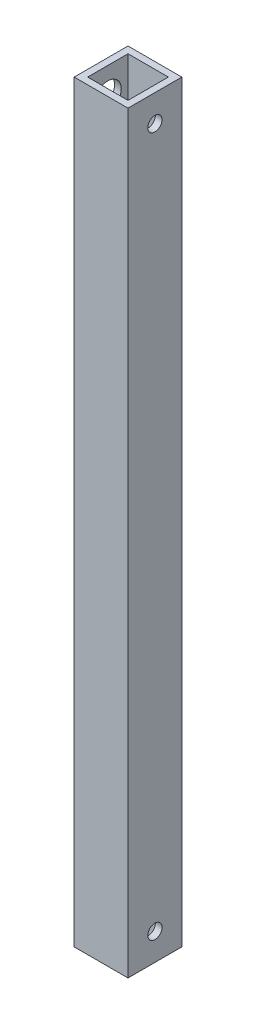
ISO-10303-21;
HEADER;
FILE_DESCRIPTION(('STEP AP214'),'2;1');
FILE_NAME('part.step','',(''),(''),'','','');
FILE_SCHEMA(('AUTOMOTIVE_DESIGN { 1 0 10303 214 1 1 1 1 }'));
ENDSEC;
DATA;
#1=APPLICATION_CONTEXT('core data for automotive mechanical design processes');
#2=APPLICATION_PROTOCOL_DEFINITION('international standard','automotive_design',2000,#1);
#3=PRODUCT_CONTEXT('',#1,'mechanical');
#4=PRODUCT('Part','Part','',(#3));
#5=PRODUCT_RELATED_PRODUCT_CATEGORY('part','',(#4));
#6=PRODUCT_DEFINITION_FORMATION('','',#4);
#7=PRODUCT_DEFINITION_CONTEXT('part definition',#1,'design');
#8=PRODUCT_DEFINITION('design','',#6,#7);
#9=PRODUCT_DEFINITION_SHAPE('','',#8);
#10=(LENGTH_UNIT() NAMED_UNIT(*) SI_UNIT(.MILLI.,.METRE.));
#11=(NAMED_UNIT(*) PLANE_ANGLE_UNIT() SI_UNIT($,.RADIAN.));
#12=(NAMED_UNIT(*) SI_UNIT($,.STERADIAN.) SOLID_ANGLE_UNIT());
#13=UNCERTAINTY_MEASURE_WITH_UNIT(LENGTH_MEASURE(1.E-05),#10,'distance_accuracy_value','');
#14=(GEOMETRIC_REPRESENTATION_CONTEXT(3) GLOBAL_UNCERTAINTY_ASSIGNED_CONTEXT((#13)) GLOBAL_UNIT_ASSIGNED_CONTEXT((#10,
#11,#12)) REPRESENTATION_CONTEXT('',''));
#15=CARTESIAN_POINT('',(0.,0.,0.));
#16=DIRECTION('',(0.,0.,1.));
#17=DIRECTION('',(1.,0.,0.));
#18=AXIS2_PLACEMENT_3D('',#15,#16,#17);
#19=CARTESIAN_POINT('',(0.,355.6,0.));
#20=DIRECTION('',(0.,-1.,0.));
#21=DIRECTION('',(0.,0.,-1.));
#22=AXIS2_PLACEMENT_3D('',#19,#20,#21);
#23=PLANE('',#22);
#24=DIRECTION('',(0.,0.,1.));
#25=VECTOR('',#24,1.);
#26=CARTESIAN_POINT('',(0.,355.6,0.));
#27=LINE('',#26,#25);
#28=CARTESIAN_POINT('',(0.,355.6,-25.4));
#29=VERTEX_POINT('',#28);
#30=CARTESIAN_POINT('',(0.,355.6,0.));
#31=VERTEX_POINT('',#30);
#32=EDGE_CURVE('E135',#29,#31,#27,.T.);
#33=ORIENTED_EDGE('',*,*,#32,.T.);
#34=DIRECTION('',(1.,0.,0.));
#35=VECTOR('',#34,1.);
#36=CARTESIAN_POINT('',(0.,355.6,0.));
#37=LINE('',#36,#35);
#38=CARTESIAN_POINT('',(25.4,355.6,0.));
#39=VERTEX_POINT('',#38);
#40=EDGE_CURVE('E138',#31,#39,#37,.T.);
#41=ORIENTED_EDGE('',*,*,#40,.T.);
#42=DIRECTION('',(0.,0.,-1.));
#43=VECTOR('',#42,1.);
#44=CARTESIAN_POINT('',(25.4,355.6,0.));
#45=LINE('',#44,#43);
#46=CARTESIAN_POINT('',(25.4,355.6,-25.4));
#47=VERTEX_POINT('',#46);
#48=EDGE_CURVE('E141',#39,#47,#45,.T.);
#49=ORIENTED_EDGE('',*,*,#48,.T.);
#50=DIRECTION('',(-1.,0.,0.));
#51=VECTOR('',#50,1.);
#52=CARTESIAN_POINT('',(0.,355.6,-25.4));
#53=LINE('',#52,#51);
#54=EDGE_CURVE('E143',#47,#29,#53,.T.);
#55=ORIENTED_EDGE('',*,*,#54,.T.);
#56=EDGE_LOOP('',(#33,#41,#49,#55));
#57=FACE_BOUND('',#56,.T.);
#58=DIRECTION('',(1.,0.,0.));
#59=VECTOR('',#58,1.);
#60=CARTESIAN_POINT('',(3.175,355.6,-3.175));
#61=LINE('',#60,#59);
#62=CARTESIAN_POINT('',(3.175,355.6,-3.175));
#63=VERTEX_POINT('',#62);
#64=CARTESIAN_POINT('',(22.225,355.6,-3.175));
#65=VERTEX_POINT('',#64);
#66=EDGE_CURVE('E97',#63,#65,#61,.T.);
#67=ORIENTED_EDGE('',*,*,#66,.F.);
#68=DIRECTION('',(0.,0.,1.));
#69=VECTOR('',#68,1.);
#70=CARTESIAN_POINT('',(3.175,355.6,-3.175));
#71=LINE('',#70,#69);
#72=CARTESIAN_POINT('',(3.175,355.6,-22.225));
#73=VERTEX_POINT('',#72);
#74=EDGE_CURVE('E119',#73,#63,#71,.T.);
#75=ORIENTED_EDGE('',*,*,#74,.F.);
#76=DIRECTION('',(-1.,0.,0.));
#77=VECTOR('',#76,1.);
#78=CARTESIAN_POINT('',(3.175,355.6,-22.225));
#79=LINE('',#78,#77);
#80=CARTESIAN_POINT('',(22.225,355.6,-22.225));
#81=VERTEX_POINT('',#80);
#82=EDGE_CURVE('E117',#81,#73,#79,.T.);
#83=ORIENTED_EDGE('',*,*,#82,.F.);
#84=DIRECTION('',(0.,0.,-1.));
#85=VECTOR('',#84,1.);
#86=CARTESIAN_POINT('',(22.225,355.6,-3.175));
#87=LINE('',#86,#85);
#88=EDGE_CURVE('E105',#65,#81,#87,.T.);
#89=ORIENTED_EDGE('',*,*,#88,.F.);
#90=EDGE_LOOP('',(#67,#75,#83,#89));
#91=FACE_BOUND('',#90,.T.);
#92=ADVANCED_FACE('F32',(#57,#91),#23,.F.);
#93=CARTESIAN_POINT('',(0.,0.,0.));
#94=DIRECTION('',(0.,-1.,0.));
#95=DIRECTION('',(0.,0.,-1.));
#96=AXIS2_PLACEMENT_3D('',#93,#94,#95);
#97=PLANE('',#96);
#98=DIRECTION('',(0.,0.,1.));
#99=VECTOR('',#98,1.);
#100=CARTESIAN_POINT('',(0.,0.,0.));
#101=LINE('',#100,#99);
#102=CARTESIAN_POINT('',(0.,0.,-25.4));
#103=VERTEX_POINT('',#102);
#104=CARTESIAN_POINT('',(0.,0.,0.));
#105=VERTEX_POINT('',#104);
#106=EDGE_CURVE('E113',#103,#105,#101,.T.);
#107=ORIENTED_EDGE('',*,*,#106,.F.);
#108=DIRECTION('',(-1.,0.,0.));
#109=VECTOR('',#108,1.);
#110=CARTESIAN_POINT('',(0.,0.,-25.4));
#111=LINE('',#110,#109);
#112=CARTESIAN_POINT('',(25.4,0.,-25.4));
#113=VERTEX_POINT('',#112);
#114=EDGE_CURVE('E139',#113,#103,#111,.T.);
#115=ORIENTED_EDGE('',*,*,#114,.F.);
#116=DIRECTION('',(0.,0.,-1.));
#117=VECTOR('',#116,1.);
#118=CARTESIAN_POINT('',(25.4,0.,0.));
#119=LINE('',#118,#117);
#120=CARTESIAN_POINT('',(25.4,0.,0.));
#121=VERTEX_POINT('',#120);
#122=EDGE_CURVE('E150',#121,#113,#119,.T.);
#123=ORIENTED_EDGE('',*,*,#122,.F.);
#124=DIRECTION('',(1.,0.,0.));
#125=VECTOR('',#124,1.);
#126=CARTESIAN_POINT('',(0.,0.,0.));
#127=LINE('',#126,#125);
#128=EDGE_CURVE('E148',#105,#121,#127,.T.);
#129=ORIENTED_EDGE('',*,*,#128,.F.);
#130=EDGE_LOOP('',(#107,#115,#123,#129));
#131=FACE_BOUND('',#130,.T.);
#132=DIRECTION('',(0.,0.,1.));
#133=VECTOR('',#132,1.);
#134=CARTESIAN_POINT('',(3.175,0.,-3.175));
#135=LINE('',#134,#133);
#136=CARTESIAN_POINT('',(3.175,0.,-22.225));
#137=VERTEX_POINT('',#136);
#138=CARTESIAN_POINT('',(3.175,0.,-3.175));
#139=VERTEX_POINT('',#138);
#140=EDGE_CURVE('E106',#137,#139,#135,.T.);
#141=ORIENTED_EDGE('',*,*,#140,.T.);
#142=DIRECTION('',(1.,0.,0.));
#143=VECTOR('',#142,1.);
#144=CARTESIAN_POINT('',(3.175,0.,-3.175));
#145=LINE('',#144,#143);
#146=CARTESIAN_POINT('',(22.225,0.,-3.175));
#147=VERTEX_POINT('',#146);
#148=EDGE_CURVE('E55',#139,#147,#145,.T.);
#149=ORIENTED_EDGE('',*,*,#148,.T.);
#150=DIRECTION('',(0.,0.,-1.));
#151=VECTOR('',#150,1.);
#152=CARTESIAN_POINT('',(22.225,0.,-3.175));
#153=LINE('',#152,#151);
#154=CARTESIAN_POINT('',(22.225,0.,-22.225));
#155=VERTEX_POINT('',#154);
#156=EDGE_CURVE('E112',#147,#155,#153,.T.);
#157=ORIENTED_EDGE('',*,*,#156,.T.);
#158=DIRECTION('',(-1.,0.,0.));
#159=VECTOR('',#158,1.);
#160=CARTESIAN_POINT('',(3.175,0.,-22.225));
#161=LINE('',#160,#159);
#162=EDGE_CURVE('E127',#155,#137,#161,.T.);
#163=ORIENTED_EDGE('',*,*,#162,.T.);
#164=EDGE_LOOP('',(#141,#149,#157,#163));
#165=FACE_BOUND('',#164,.T.);
#166=ADVANCED_FACE('F168',(#131,#165),#97,.T.);
#167=CARTESIAN_POINT('',(0.,355.6,0.));
#168=DIRECTION('',(1.,0.,0.));
#169=DIRECTION('',(0.,0.,-1.));
#170=AXIS2_PLACEMENT_3D('',#167,#168,#169);
#171=PLANE('',#170);
#172=CARTESIAN_POINT('',(0.,12.7,-12.7));
#173=DIRECTION('',(-1.,0.,0.));
#174=DIRECTION('',(0.,0.,1.));
#175=AXIS2_PLACEMENT_3D('',#172,#173,#174);
#176=CIRCLE('',#175,6.35);
#177=CARTESIAN_POINT('',(0.,12.7,-6.34999999999997));
#178=VERTEX_POINT('',#177);
#179=EDGE_CURVE('E240',#178,#178,#176,.T.);
#180=ORIENTED_EDGE('',*,*,#179,.F.);
#181=EDGE_LOOP('',(#180));
#182=FACE_BOUND('',#181,.T.);
#183=CARTESIAN_POINT('',(0.,342.9,-12.7));
#184=DIRECTION('',(-1.,0.,0.));
#185=DIRECTION('',(0.,0.,1.));
#186=AXIS2_PLACEMENT_3D('',#183,#184,#185);
#187=CIRCLE('',#186,6.35);
#188=CARTESIAN_POINT('',(0.,342.9,-6.34999999999997));
#189=VERTEX_POINT('',#188);
#190=EDGE_CURVE('E244',#189,#189,#187,.T.);
#191=ORIENTED_EDGE('',*,*,#190,.F.);
#192=EDGE_LOOP('',(#191));
#193=FACE_BOUND('',#192,.T.);
#194=ORIENTED_EDGE('',*,*,#106,.T.);
#195=DIRECTION('',(0.,-1.,0.));
#196=VECTOR('',#195,1.);
#197=CARTESIAN_POINT('',(0.,355.6,0.));
#198=LINE('',#197,#196);
#199=EDGE_CURVE('E11',#31,#105,#198,.T.);
#200=ORIENTED_EDGE('',*,*,#199,.F.);
#201=ORIENTED_EDGE('',*,*,#32,.F.);
#202=DIRECTION('',(0.,-1.,0.));
#203=VECTOR('',#202,1.);
#204=CARTESIAN_POINT('',(0.,355.6,-25.4));
#205=LINE('',#204,#203);
#206=EDGE_CURVE('E145',#29,#103,#205,.T.);
#207=ORIENTED_EDGE('',*,*,#206,.T.);
#208=EDGE_LOOP('',(#194,#200,#201,#207));
#209=FACE_BOUND('',#208,.T.);
#210=ADVANCED_FACE('F34',(#182,#193,#209),#171,.F.);
#211=CARTESIAN_POINT('',(0.,355.6,0.));
#212=DIRECTION('',(0.,0.,-1.));
#213=DIRECTION('',(-1.,0.,0.));
#214=AXIS2_PLACEMENT_3D('',#211,#212,#213);
#215=PLANE('',#214);
#216=ORIENTED_EDGE('',*,*,#128,.T.);
#217=DIRECTION('',(0.,-1.,0.));
#218=VECTOR('',#217,1.);
#219=CARTESIAN_POINT('',(25.4,355.6,0.));
#220=LINE('',#219,#218);
#221=EDGE_CURVE('E40',#39,#121,#220,.T.);
#222=ORIENTED_EDGE('',*,*,#221,.F.);
#223=ORIENTED_EDGE('',*,*,#40,.F.);
#224=ORIENTED_EDGE('',*,*,#199,.T.);
#225=EDGE_LOOP('',(#216,#222,#223,#224));
#226=FACE_BOUND('',#225,.T.);
#227=ADVANCED_FACE('F178',(#226),#215,.F.);
#228=CARTESIAN_POINT('',(25.4,355.6,0.));
#229=DIRECTION('',(-1.,0.,0.));
#230=DIRECTION('',(0.,0.,1.));
#231=AXIS2_PLACEMENT_3D('',#228,#229,#230);
#232=PLANE('',#231);
#233=CARTESIAN_POINT('',(25.4,342.9,-12.7));
#234=DIRECTION('',(-1.,0.,0.));
#235=DIRECTION('',(0.,0.,-1.));
#236=AXIS2_PLACEMENT_3D('',#233,#234,#235);
#237=CIRCLE('',#236,3.3734375);
#238=CARTESIAN_POINT('',(25.4,342.9,-16.0734375));
#239=VERTEX_POINT('',#238);
#240=EDGE_CURVE('E249',#239,#239,#237,.T.);
#241=ORIENTED_EDGE('',*,*,#240,.T.);
#242=EDGE_LOOP('',(#241));
#243=FACE_BOUND('',#242,.T.);
#244=CARTESIAN_POINT('',(25.4,12.7,-12.7));
#245=DIRECTION('',(1.,0.,0.));
#246=DIRECTION('',(0.,0.,-1.));
#247=AXIS2_PLACEMENT_3D('',#244,#245,#246);
#248=CIRCLE('',#247,3.3734375);
#249=CARTESIAN_POINT('',(25.4,12.7,-16.0734375));
#250=VERTEX_POINT('',#249);
#251=EDGE_CURVE('E255',#250,#250,#248,.T.);
#252=ORIENTED_EDGE('',*,*,#251,.F.);
#253=EDGE_LOOP('',(#252));
#254=FACE_BOUND('',#253,.T.);
#255=ORIENTED_EDGE('',*,*,#122,.T.);
#256=DIRECTION('',(0.,-1.,0.));
#257=VECTOR('',#256,1.);
#258=CARTESIAN_POINT('',(25.4,355.6,-25.4));
#259=LINE('',#258,#257);
#260=EDGE_CURVE('E155',#47,#113,#259,.T.);
#261=ORIENTED_EDGE('',*,*,#260,.F.);
#262=ORIENTED_EDGE('',*,*,#48,.F.);
#263=ORIENTED_EDGE('',*,*,#221,.T.);
#264=EDGE_LOOP('',(#255,#261,#262,#263));
#265=FACE_BOUND('',#264,.T.);
#266=ADVANCED_FACE('F162',(#243,#254,#265),#232,.F.);
#267=CARTESIAN_POINT('',(0.,355.6,-25.4));
#268=DIRECTION('',(0.,0.,1.));
#269=DIRECTION('',(1.,0.,0.));
#270=AXIS2_PLACEMENT_3D('',#267,#268,#269);
#271=PLANE('',#270);
#272=ORIENTED_EDGE('',*,*,#114,.T.);
#273=ORIENTED_EDGE('',*,*,#206,.F.);
#274=ORIENTED_EDGE('',*,*,#54,.F.);
#275=ORIENTED_EDGE('',*,*,#260,.T.);
#276=EDGE_LOOP('',(#272,#273,#274,#275));
#277=FACE_BOUND('',#276,.T.);
#278=ADVANCED_FACE('F172',(#277),#271,.F.);
#279=CARTESIAN_POINT('',(3.175,355.6,-3.175));
#280=DIRECTION('',(0.,0.,-1.));
#281=DIRECTION('',(-1.,0.,0.));
#282=AXIS2_PLACEMENT_3D('',#279,#280,#281);
#283=PLANE('',#282);
#284=ORIENTED_EDGE('',*,*,#148,.F.);
#285=DIRECTION('',(0.,-1.,0.));
#286=VECTOR('',#285,1.);
#287=CARTESIAN_POINT('',(3.175,355.6,-3.175));
#288=LINE('',#287,#286);
#289=EDGE_CURVE('E101',#63,#139,#288,.T.);
#290=ORIENTED_EDGE('',*,*,#289,.F.);
#291=ORIENTED_EDGE('',*,*,#66,.T.);
#292=DIRECTION('',(0.,-1.,0.));
#293=VECTOR('',#292,1.);
#294=CARTESIAN_POINT('',(22.225,355.6,-3.175));
#295=LINE('',#294,#293);
#296=EDGE_CURVE('E100',#65,#147,#295,.T.);
#297=ORIENTED_EDGE('',*,*,#296,.T.);
#298=EDGE_LOOP('',(#284,#290,#291,#297));
#299=FACE_BOUND('',#298,.T.);
#300=ADVANCED_FACE('F99',(#299),#283,.T.);
#301=CARTESIAN_POINT('',(22.225,355.6,-3.175));
#302=DIRECTION('',(-1.,0.,0.));
#303=DIRECTION('',(0.,0.,1.));
#304=AXIS2_PLACEMENT_3D('',#301,#302,#303);
#305=PLANE('',#304);
#306=CARTESIAN_POINT('',(22.225,342.9,-12.7));
#307=DIRECTION('',(-1.,0.,0.));
#308=DIRECTION('',(0.,0.,1.));
#309=AXIS2_PLACEMENT_3D('',#306,#307,#308);
#310=CIRCLE('',#309,3.3734375);
#311=CARTESIAN_POINT('',(22.225,342.9,-16.0734375));
#312=VERTEX_POINT('',#311);
#313=EDGE_CURVE('E253',#312,#312,#310,.F.);
#314=ORIENTED_EDGE('',*,*,#313,.T.);
#315=EDGE_LOOP('',(#314));
#316=FACE_BOUND('',#315,.T.);
#317=CARTESIAN_POINT('',(22.225,12.7,-12.7));
#318=DIRECTION('',(-1.,0.,0.));
#319=DIRECTION('',(0.,0.,1.));
#320=AXIS2_PLACEMENT_3D('',#317,#318,#319);
#321=CIRCLE('',#320,3.3734375);
#322=CARTESIAN_POINT('',(22.225,12.7,-9.32656249999998));
#323=VERTEX_POINT('',#322);
#324=EDGE_CURVE('E125',#323,#323,#321,.T.);
#325=ORIENTED_EDGE('',*,*,#324,.F.);
#326=EDGE_LOOP('',(#325));
#327=FACE_BOUND('',#326,.T.);
#328=ORIENTED_EDGE('',*,*,#156,.F.);
#329=ORIENTED_EDGE('',*,*,#296,.F.);
#330=ORIENTED_EDGE('',*,*,#88,.T.);
#331=DIRECTION('',(0.,-1.,0.));
#332=VECTOR('',#331,1.);
#333=CARTESIAN_POINT('',(22.225,355.6,-22.225));
#334=LINE('',#333,#332);
#335=EDGE_CURVE('E114',#81,#155,#334,.T.);
#336=ORIENTED_EDGE('',*,*,#335,.T.);
#337=EDGE_LOOP('',(#328,#329,#330,#336));
#338=FACE_BOUND('',#337,.T.);
#339=ADVANCED_FACE('F109',(#316,#327,#338),#305,.T.);
#340=CARTESIAN_POINT('',(3.175,355.6,-22.225));
#341=DIRECTION('',(0.,0.,1.));
#342=DIRECTION('',(1.,0.,0.));
#343=AXIS2_PLACEMENT_3D('',#340,#341,#342);
#344=PLANE('',#343);
#345=ORIENTED_EDGE('',*,*,#162,.F.);
#346=ORIENTED_EDGE('',*,*,#335,.F.);
#347=ORIENTED_EDGE('',*,*,#82,.T.);
#348=DIRECTION('',(0.,-1.,0.));
#349=VECTOR('',#348,1.);
#350=CARTESIAN_POINT('',(3.175,355.6,-22.225));
#351=LINE('',#350,#349);
#352=EDGE_CURVE('E47',#73,#137,#351,.T.);
#353=ORIENTED_EDGE('',*,*,#352,.T.);
#354=EDGE_LOOP('',(#345,#346,#347,#353));
#355=FACE_BOUND('',#354,.T.);
#356=ADVANCED_FACE('F203',(#355),#344,.T.);
#357=CARTESIAN_POINT('',(3.175,355.6,-3.175));
#358=DIRECTION('',(1.,0.,0.));
#359=DIRECTION('',(0.,0.,-1.));
#360=AXIS2_PLACEMENT_3D('',#357,#358,#359);
#361=PLANE('',#360);
#362=CARTESIAN_POINT('',(3.175,12.7,-12.7));
#363=DIRECTION('',(1.,0.,0.));
#364=DIRECTION('',(0.,0.,-1.));
#365=AXIS2_PLACEMENT_3D('',#362,#363,#364);
#366=CIRCLE('',#365,6.35);
#367=CARTESIAN_POINT('',(3.175,12.7,-19.05));
#368=VERTEX_POINT('',#367);
#369=EDGE_CURVE('E237',#368,#368,#366,.F.);
#370=ORIENTED_EDGE('',*,*,#369,.T.);
#371=EDGE_LOOP('',(#370));
#372=FACE_BOUND('',#371,.T.);
#373=CARTESIAN_POINT('',(3.175,342.9,-12.7));
#374=DIRECTION('',(1.,0.,0.));
#375=DIRECTION('',(0.,0.,-1.));
#376=AXIS2_PLACEMENT_3D('',#373,#374,#375);
#377=CIRCLE('',#376,6.35);
#378=CARTESIAN_POINT('',(3.175,342.9,-19.05));
#379=VERTEX_POINT('',#378);
#380=EDGE_CURVE('E241',#379,#379,#377,.F.);
#381=ORIENTED_EDGE('',*,*,#380,.T.);
#382=EDGE_LOOP('',(#381));
#383=FACE_BOUND('',#382,.T.);
#384=ORIENTED_EDGE('',*,*,#140,.F.);
#385=ORIENTED_EDGE('',*,*,#352,.F.);
#386=ORIENTED_EDGE('',*,*,#74,.T.);
#387=ORIENTED_EDGE('',*,*,#289,.T.);
#388=EDGE_LOOP('',(#384,#385,#386,#387));
#389=FACE_BOUND('',#388,.T.);
#390=ADVANCED_FACE('F208',(#372,#383,#389),#361,.T.);
#391=CARTESIAN_POINT('',(0.,12.7,-12.7));
#392=DIRECTION('',(1.,0.,0.));
#393=DIRECTION('',(0.,0.,-1.));
#394=AXIS2_PLACEMENT_3D('',#391,#392,#393);
#395=CYLINDRICAL_SURFACE('',#394,3.3734375);
#396=ORIENTED_EDGE('',*,*,#324,.T.);
#397=EDGE_LOOP('',(#396));
#398=FACE_BOUND('',#397,.T.);
#399=ORIENTED_EDGE('',*,*,#251,.T.);
#400=EDGE_LOOP('',(#399));
#401=FACE_BOUND('',#400,.T.);
#402=ADVANCED_FACE('F216',(#398,#401),#395,.F.);
#403=CARTESIAN_POINT('',(0.,342.9,-12.7));
#404=DIRECTION('',(1.,0.,0.));
#405=DIRECTION('',(0.,0.,-1.));
#406=AXIS2_PLACEMENT_3D('',#403,#404,#405);
#407=CYLINDRICAL_SURFACE('',#406,3.3734375);
#408=CARTESIAN_POINT('',(22.225,342.9,-16.0734375));
#409=CARTESIAN_POINT('',(22.2580729166667,342.9,-16.0734375));
#410=CARTESIAN_POINT('',(22.2911458333333,342.9,-16.0734375));
#411=CARTESIAN_POINT('',(22.3572916666667,342.9,-16.0734375));
#412=CARTESIAN_POINT('',(22.3903645833333,342.9,-16.0734375));
#413=CARTESIAN_POINT('',(22.4565104166667,342.9,-16.0734375));
#414=CARTESIAN_POINT('',(22.4895833333333,342.9,-16.0734375));
#415=CARTESIAN_POINT('',(22.5557291666667,342.9,-16.0734375));
#416=CARTESIAN_POINT('',(22.5888020833333,342.9,-16.0734375));
#417=CARTESIAN_POINT('',(22.6549479166667,342.9,-16.0734375));
#418=CARTESIAN_POINT('',(22.6880208333333,342.9,-16.0734375));
#419=CARTESIAN_POINT('',(22.7541666666667,342.9,-16.0734375));
#420=CARTESIAN_POINT('',(22.7872395833333,342.9,-16.0734375));
#421=CARTESIAN_POINT('',(22.8533854166667,342.9,-16.0734375));
#422=CARTESIAN_POINT('',(22.8864583333333,342.9,-16.0734375));
#423=CARTESIAN_POINT('',(22.9526041666667,342.9,-16.0734375));
#424=CARTESIAN_POINT('',(22.9856770833333,342.9,-16.0734375));
#425=CARTESIAN_POINT('',(23.0518229166667,342.9,-16.0734375));
#426=CARTESIAN_POINT('',(23.0848958333333,342.9,-16.0734375));
#427=CARTESIAN_POINT('',(23.1510416666667,342.9,-16.0734375));
#428=CARTESIAN_POINT('',(23.1841145833333,342.9,-16.0734375));
#429=CARTESIAN_POINT('',(23.2502604166667,342.9,-16.0734375));
#430=CARTESIAN_POINT('',(23.2833333333333,342.9,-16.0734375));
#431=CARTESIAN_POINT('',(23.3494791666667,342.9,-16.0734375));
#432=CARTESIAN_POINT('',(23.3825520833333,342.9,-16.0734375));
#433=CARTESIAN_POINT('',(23.4486979166667,342.9,-16.0734375));
#434=CARTESIAN_POINT('',(23.4817708333333,342.9,-16.0734375));
#435=CARTESIAN_POINT('',(23.5479166666667,342.9,-16.0734375));
#436=CARTESIAN_POINT('',(23.5809895833333,342.9,-16.0734375));
#437=CARTESIAN_POINT('',(23.6471354166667,342.9,-16.0734375));
#438=CARTESIAN_POINT('',(23.6802083333333,342.9,-16.0734375));
#439=CARTESIAN_POINT('',(23.7463541666667,342.9,-16.0734375));
#440=CARTESIAN_POINT('',(23.7794270833333,342.9,-16.0734375));
#441=CARTESIAN_POINT('',(23.8455729166667,342.9,-16.0734375));
#442=CARTESIAN_POINT('',(23.8786458333333,342.9,-16.0734375));
#443=CARTESIAN_POINT('',(23.9447916666667,342.9,-16.0734375));
#444=CARTESIAN_POINT('',(23.9778645833333,342.9,-16.0734375));
#445=CARTESIAN_POINT('',(24.0440104166667,342.9,-16.0734375));
#446=CARTESIAN_POINT('',(24.0770833333333,342.9,-16.0734375));
#447=CARTESIAN_POINT('',(24.1432291666667,342.9,-16.0734375));
#448=CARTESIAN_POINT('',(24.1763020833333,342.9,-16.0734375));
#449=CARTESIAN_POINT('',(24.2424479166667,342.9,-16.0734375));
#450=CARTESIAN_POINT('',(24.2755208333333,342.9,-16.0734375));
#451=CARTESIAN_POINT('',(24.3416666666667,342.9,-16.0734375));
#452=CARTESIAN_POINT('',(24.3747395833333,342.9,-16.0734375));
#453=CARTESIAN_POINT('',(24.4408854166667,342.9,-16.0734375));
#454=CARTESIAN_POINT('',(24.4739583333333,342.9,-16.0734375));
#455=CARTESIAN_POINT('',(24.5401041666667,342.9,-16.0734375));
#456=CARTESIAN_POINT('',(24.5731770833333,342.9,-16.0734375));
#457=CARTESIAN_POINT('',(24.6393229166667,342.9,-16.0734375));
#458=CARTESIAN_POINT('',(24.6723958333333,342.9,-16.0734375));
#459=CARTESIAN_POINT('',(24.7385416666667,342.9,-16.0734375));
#460=CARTESIAN_POINT('',(24.7716145833333,342.9,-16.0734375));
#461=CARTESIAN_POINT('',(24.8377604166667,342.9,-16.0734375));
#462=CARTESIAN_POINT('',(24.8708333333333,342.9,-16.0734375));
#463=CARTESIAN_POINT('',(24.9369791666667,342.9,-16.0734375));
#464=CARTESIAN_POINT('',(24.9700520833333,342.9,-16.0734375));
#465=CARTESIAN_POINT('',(25.0361979166667,342.9,-16.0734375));
#466=CARTESIAN_POINT('',(25.0692708333333,342.9,-16.0734375));
#467=CARTESIAN_POINT('',(25.1354166666667,342.9,-16.0734375));
#468=CARTESIAN_POINT('',(25.1684895833333,342.9,-16.0734375));
#469=CARTESIAN_POINT('',(25.2346354166667,342.9,-16.0734375));
#470=CARTESIAN_POINT('',(25.2677083333333,342.9,-16.0734375));
#471=CARTESIAN_POINT('',(25.3338541666667,342.9,-16.0734375));
#472=CARTESIAN_POINT('',(25.3669270833333,342.9,-16.0734375));
#473=CARTESIAN_POINT('',(25.4,342.9,-16.0734375));
#474=B_SPLINE_CURVE_WITH_KNOTS('',3,(#408,#409,#410,#411,#412,#413,#414,#415,#416,#417,#418,
#419,#420,#421,#422,#423,#424,#425,#426,#427,#428,#429,#430,#431,#432,#433,#434,#435,#436,#437,
#438,#439,#440,#441,#442,#443,#444,#445,#446,#447,#448,#449,#450,#451,#452,#453,#454,#455,#456,
#457,#458,#459,#460,#461,#462,#463,#464,#465,#466,#467,#468,#469,#470,#471,#472,#473),
.UNSPECIFIED.,.F.,.F.,(4,2,2,2,2,2,2,2,2,2,2,2,2,2,2,2,2,2,2,2,2,2,2,2,2,2,2,2,2,2,2,2,4),(0.,
0.0992187500000012,0.198437499999999,0.29765625,0.396874999999998,0.496093749999999,
0.595312499999997,0.694531249999998,0.793749999999996,0.892968749999997,0.992187499999998,
1.09140625,1.190625,1.28984375,1.3890625,1.48828124999999,1.5875,1.68671875,1.78593749999999,
1.88515625,1.98437499999999,2.08359374999999,2.18281249999999,2.28203124999999,2.38124999999999,
2.48046874999999,2.57968749999999,2.67890624999999,2.77812499999999,2.87734374999999,
2.97656249999999,3.07578124999999,3.17499999999999),.UNSPECIFIED.);
#475=EDGE_CURVE('BSEAM220',#312,#239,#474,.T.);
#476=ORIENTED_EDGE('',*,*,#313,.F.);
#477=ORIENTED_EDGE('',*,*,#240,.F.);
#478=ORIENTED_EDGE('',*,*,#475,.T.);
#479=ORIENTED_EDGE('',*,*,#475,.F.);
#480=EDGE_LOOP('',(#476,#478,#477,#479));
#481=FACE_BOUND('',#480,.T.);
#482=ADVANCED_FACE('F220',(#481),#407,.F.);
#483=CARTESIAN_POINT('',(25.401,342.9,-12.7));
#484=DIRECTION('',(-1.,0.,0.));
#485=DIRECTION('',(0.,0.,1.));
#486=AXIS2_PLACEMENT_3D('',#483,#484,#485);
#487=CYLINDRICAL_SURFACE('',#486,6.35);
#488=ORIENTED_EDGE('',*,*,#380,.F.);
#489=EDGE_LOOP('',(#488));
#490=FACE_BOUND('',#489,.T.);
#491=ORIENTED_EDGE('',*,*,#190,.T.);
#492=EDGE_LOOP('',(#491));
#493=FACE_BOUND('',#492,.T.);
#494=ADVANCED_FACE('F224',(#490,#493),#487,.F.);
#495=CARTESIAN_POINT('',(25.401,12.7,-12.7));
#496=DIRECTION('',(-1.,0.,0.));
#497=DIRECTION('',(0.,0.,1.));
#498=AXIS2_PLACEMENT_3D('',#495,#496,#497);
#499=CYLINDRICAL_SURFACE('',#498,6.35);
#500=ORIENTED_EDGE('',*,*,#369,.F.);
#501=EDGE_LOOP('',(#500));
#502=FACE_BOUND('',#501,.T.);
#503=ORIENTED_EDGE('',*,*,#179,.T.);
#504=EDGE_LOOP('',(#503));
#505=FACE_BOUND('',#504,.T.);
#506=ADVANCED_FACE('F228',(#502,#505),#499,.F.);
#507=CLOSED_SHELL('',(#92,#166,#210,#227,#266,#278,#300,#339,#356,#390,#402,#482,#494,#506));
#508=MANIFOLD_SOLID_BREP('B2',#507);
#509=ADVANCED_BREP_SHAPE_REPRESENTATION('',(#18,#508),#14);
#510=SHAPE_DEFINITION_REPRESENTATION(#9,#509);
ENDSEC;
END-ISO-10303-21;
